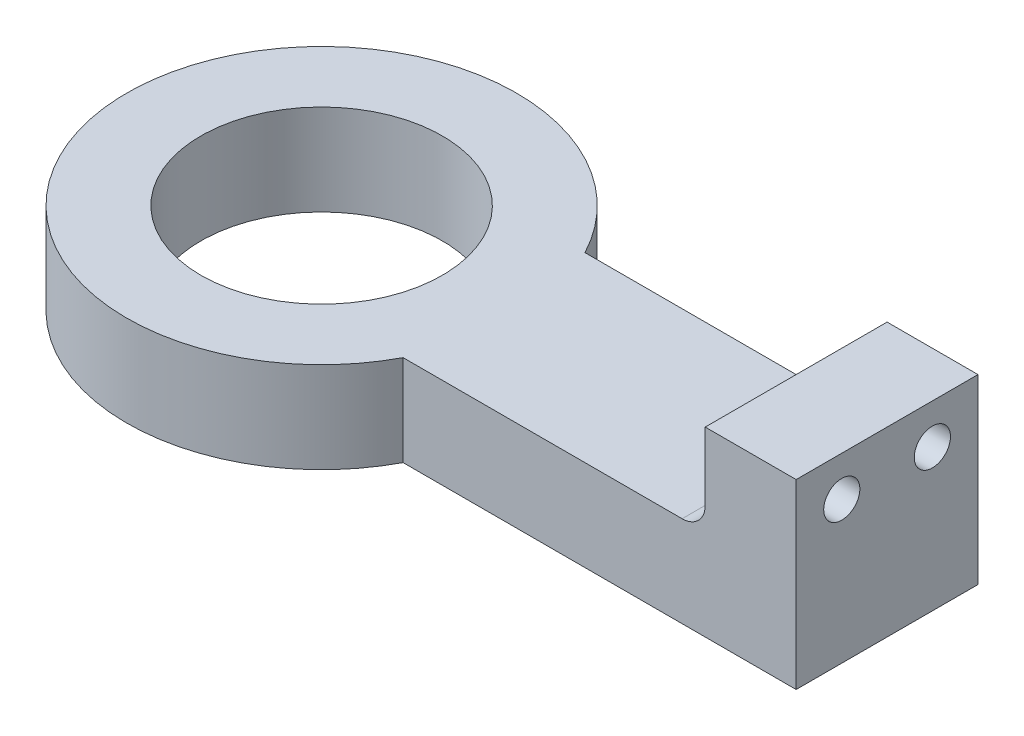
ISO-10303-21;
HEADER;
FILE_DESCRIPTION(('STEP AP214'),'2;1');
FILE_NAME('part.step','',(''),(''),'','','');
FILE_SCHEMA(('AUTOMOTIVE_DESIGN { 1 0 10303 214 1 1 1 1 }'));
ENDSEC;
DATA;
#1=APPLICATION_CONTEXT('core data for automotive mechanical design processes');
#2=APPLICATION_PROTOCOL_DEFINITION('international standard','automotive_design',2000,#1);
#3=PRODUCT_CONTEXT('',#1,'mechanical');
#4=PRODUCT('Part','Part','',(#3));
#5=PRODUCT_RELATED_PRODUCT_CATEGORY('part','',(#4));
#6=PRODUCT_DEFINITION_FORMATION('','',#4);
#7=PRODUCT_DEFINITION_CONTEXT('part definition',#1,'design');
#8=PRODUCT_DEFINITION('design','',#6,#7);
#9=PRODUCT_DEFINITION_SHAPE('','',#8);
#10=(LENGTH_UNIT() NAMED_UNIT(*) SI_UNIT(.MILLI.,.METRE.));
#11=(NAMED_UNIT(*) PLANE_ANGLE_UNIT() SI_UNIT($,.RADIAN.));
#12=(NAMED_UNIT(*) SI_UNIT($,.STERADIAN.) SOLID_ANGLE_UNIT());
#13=UNCERTAINTY_MEASURE_WITH_UNIT(LENGTH_MEASURE(1.E-05),#10,'distance_accuracy_value','');
#14=(GEOMETRIC_REPRESENTATION_CONTEXT(3) GLOBAL_UNCERTAINTY_ASSIGNED_CONTEXT((#13)) GLOBAL_UNIT_ASSIGNED_CONTEXT((#10,
#11,#12)) REPRESENTATION_CONTEXT('',''));
#15=CARTESIAN_POINT('',(0.,0.,0.));
#16=DIRECTION('',(0.,0.,1.));
#17=DIRECTION('',(1.,0.,0.));
#18=AXIS2_PLACEMENT_3D('',#15,#16,#17);
#19=CARTESIAN_POINT('',(0.,20.,0.));
#20=DIRECTION('',(0.,1.,0.));
#21=DIRECTION('',(0.,0.,1.));
#22=AXIS2_PLACEMENT_3D('',#19,#20,#21);
#23=PLANE('',#22);
#24=CARTESIAN_POINT('',(0.,20.,0.));
#25=DIRECTION('',(0.,1.,0.));
#26=DIRECTION('',(0.,0.,1.));
#27=AXIS2_PLACEMENT_3D('',#24,#25,#26);
#28=CIRCLE('',#27,26.56205);
#29=CARTESIAN_POINT('',(0.,20.,26.56205));
#30=VERTEX_POINT('',#29);
#31=EDGE_CURVE('E125',#30,#30,#28,.T.);
#32=ORIENTED_EDGE('',*,*,#31,.F.);
#33=EDGE_LOOP('',(#32));
#34=FACE_BOUND('',#33,.T.);
#35=DIRECTION('',(1.,0.,0.));
#36=VECTOR('',#35,1.);
#37=CARTESIAN_POINT('',(0.,20.,20.));
#38=LINE('',#37,#36);
#39=CARTESIAN_POINT('',(37.9228169957053,20.,20.));
#40=VERTEX_POINT('',#39);
#41=CARTESIAN_POINT('',(99.2928169957053,20.,20.));
#42=VERTEX_POINT('',#41);
#43=EDGE_CURVE('E134',#40,#42,#38,.T.);
#44=ORIENTED_EDGE('',*,*,#43,.T.);
#45=DIRECTION('',(0.,0.,-1.));
#46=VECTOR('',#45,1.);
#47=CARTESIAN_POINT('',(99.2928169957053,20.,-20.));
#48=LINE('',#47,#46);
#49=CARTESIAN_POINT('',(99.2928169957053,20.,-20.));
#50=VERTEX_POINT('',#49);
#51=EDGE_CURVE('E174',#42,#50,#48,.T.);
#52=ORIENTED_EDGE('',*,*,#51,.T.);
#53=DIRECTION('',(1.,0.,0.));
#54=VECTOR('',#53,1.);
#55=CARTESIAN_POINT('',(0.,20.,-20.));
#56=LINE('',#55,#54);
#57=CARTESIAN_POINT('',(37.9228169957053,20.,-20.));
#58=VERTEX_POINT('',#57);
#59=EDGE_CURVE('E138',#58,#50,#56,.T.);
#60=ORIENTED_EDGE('',*,*,#59,.F.);
#61=CARTESIAN_POINT('',(0.,20.,0.));
#62=DIRECTION('',(0.,1.,0.));
#63=DIRECTION('',(0.,0.,1.));
#64=AXIS2_PLACEMENT_3D('',#61,#62,#63);
#65=CIRCLE('',#64,42.8735355305549);
#66=EDGE_CURVE('E129',#58,#40,#65,.T.);
#67=ORIENTED_EDGE('',*,*,#66,.T.);
#68=EDGE_LOOP('',(#44,#52,#60,#67));
#69=FACE_BOUND('',#68,.T.);
#70=ADVANCED_FACE('F41',(#34,#69),#23,.T.);
#71=CARTESIAN_POINT('',(0.,20.,0.));
#72=DIRECTION('',(0.,-1.,0.));
#73=DIRECTION('',(0.,0.,-1.));
#74=AXIS2_PLACEMENT_3D('',#71,#72,#73);
#75=CYLINDRICAL_SURFACE('',#74,42.8735355305549);
#76=CARTESIAN_POINT('',(0.,0.,0.));
#77=DIRECTION('',(0.,1.,0.));
#78=DIRECTION('',(0.,0.,1.));
#79=AXIS2_PLACEMENT_3D('',#76,#77,#78);
#80=CIRCLE('',#79,42.8735355305549);
#81=CARTESIAN_POINT('',(37.9228169957053,0.,-20.));
#82=VERTEX_POINT('',#81);
#83=CARTESIAN_POINT('',(37.9228169957053,0.,20.));
#84=VERTEX_POINT('',#83);
#85=EDGE_CURVE('E146',#82,#84,#80,.T.);
#86=ORIENTED_EDGE('',*,*,#85,.T.);
#87=DIRECTION('',(0.,-1.,0.));
#88=VECTOR('',#87,1.);
#89=CARTESIAN_POINT('',(37.9228169957053,20.,20.));
#90=LINE('',#89,#88);
#91=EDGE_CURVE('E170',#40,#84,#90,.T.);
#92=ORIENTED_EDGE('',*,*,#91,.F.);
#93=ORIENTED_EDGE('',*,*,#66,.F.);
#94=DIRECTION('',(0.,-1.,0.));
#95=VECTOR('',#94,1.);
#96=CARTESIAN_POINT('',(37.9228169957053,20.,-20.));
#97=LINE('',#96,#95);
#98=EDGE_CURVE('E141',#58,#82,#97,.T.);
#99=ORIENTED_EDGE('',*,*,#98,.T.);
#100=EDGE_LOOP('',(#86,#92,#93,#99));
#101=FACE_BOUND('',#100,.T.);
#102=ADVANCED_FACE('F225',(#101),#75,.T.);
#103=CARTESIAN_POINT('',(0.,20.,20.));
#104=DIRECTION('',(0.,0.,-1.));
#105=DIRECTION('',(-1.,0.,0.));
#106=AXIS2_PLACEMENT_3D('',#103,#104,#105);
#107=PLANE('',#106);
#108=DIRECTION('',(1.,0.,0.));
#109=VECTOR('',#108,1.);
#110=CARTESIAN_POINT('',(0.,0.,20.));
#111=LINE('',#110,#109);
#112=CARTESIAN_POINT('',(124.372816995705,0.,20.));
#113=VERTEX_POINT('',#112);
#114=EDGE_CURVE('E151',#84,#113,#111,.T.);
#115=ORIENTED_EDGE('',*,*,#114,.T.);
#116=DIRECTION('',(0.,-1.,0.));
#117=VECTOR('',#116,1.);
#118=CARTESIAN_POINT('',(124.372816995705,20.,20.));
#119=LINE('',#118,#117);
#120=CARTESIAN_POINT('',(124.372816995705,40.,20.));
#121=VERTEX_POINT('',#120);
#122=EDGE_CURVE('E167',#121,#113,#119,.T.);
#123=ORIENTED_EDGE('',*,*,#122,.F.);
#124=DIRECTION('',(-1.,0.,0.));
#125=VECTOR('',#124,1.);
#126=CARTESIAN_POINT('',(124.372816995705,40.,20.));
#127=LINE('',#126,#125);
#128=CARTESIAN_POINT('',(104.372816995705,40.,20.));
#129=VERTEX_POINT('',#128);
#130=EDGE_CURVE('E147',#121,#129,#127,.T.);
#131=ORIENTED_EDGE('',*,*,#130,.T.);
#132=DIRECTION('',(0.,-1.,0.));
#133=VECTOR('',#132,1.);
#134=CARTESIAN_POINT('',(104.372816995705,20.,20.));
#135=LINE('',#134,#133);
#136=CARTESIAN_POINT('',(104.372816995705,25.08,20.));
#137=VERTEX_POINT('',#136);
#138=EDGE_CURVE('E110',#129,#137,#135,.T.);
#139=ORIENTED_EDGE('',*,*,#138,.T.);
#140=CARTESIAN_POINT('',(99.2928169957053,25.08,20.));
#141=DIRECTION('',(0.,0.,-1.));
#142=DIRECTION('',(-1.,0.,0.));
#143=AXIS2_PLACEMENT_3D('',#140,#141,#142);
#144=CIRCLE('',#143,5.07999999999999);
#145=EDGE_CURVE('E11',#137,#42,#144,.T.);
#146=ORIENTED_EDGE('',*,*,#145,.T.);
#147=ORIENTED_EDGE('',*,*,#43,.F.);
#148=ORIENTED_EDGE('',*,*,#91,.T.);
#149=EDGE_LOOP('',(#115,#123,#131,#139,#146,#147,#148));
#150=FACE_BOUND('',#149,.T.);
#151=ADVANCED_FACE('F231',(#150),#107,.F.);
#152=CARTESIAN_POINT('',(124.372816995705,20.,0.));
#153=DIRECTION('',(1.,0.,0.));
#154=DIRECTION('',(0.,0.,-1.));
#155=AXIS2_PLACEMENT_3D('',#152,#153,#154);
#156=PLANE('',#155);
#157=CARTESIAN_POINT('',(124.372816995705,31.22176,9.96191999999998));
#158=DIRECTION('',(-1.,0.,0.));
#159=DIRECTION('',(0.,0.,1.));
#160=AXIS2_PLACEMENT_3D('',#157,#158,#159);
#161=CIRCLE('',#160,3.9773733);
#162=CARTESIAN_POINT('',(124.372816995705,31.22176,13.9392933));
#163=VERTEX_POINT('',#162);
#164=EDGE_CURVE('E105',#163,#163,#161,.T.);
#165=ORIENTED_EDGE('',*,*,#164,.T.);
#166=EDGE_LOOP('',(#165));
#167=FACE_BOUND('',#166,.T.);
#168=CARTESIAN_POINT('',(124.372816995705,31.22176,-9.96192000000002));
#169=DIRECTION('',(-1.,0.,0.));
#170=DIRECTION('',(0.,0.,1.));
#171=AXIS2_PLACEMENT_3D('',#168,#169,#170);
#172=CIRCLE('',#171,3.985133);
#173=CARTESIAN_POINT('',(124.372816995705,31.22176,-5.97678700000002));
#174=VERTEX_POINT('',#173);
#175=EDGE_CURVE('E190',#174,#174,#172,.T.);
#176=ORIENTED_EDGE('',*,*,#175,.T.);
#177=EDGE_LOOP('',(#176));
#178=FACE_BOUND('',#177,.T.);
#179=DIRECTION('',(0.,0.,1.));
#180=VECTOR('',#179,1.);
#181=CARTESIAN_POINT('',(124.372816995705,0.,0.));
#182=LINE('',#181,#180);
#183=CARTESIAN_POINT('',(124.372816995705,0.,-20.));
#184=VERTEX_POINT('',#183);
#185=EDGE_CURVE('E155',#184,#113,#182,.T.);
#186=ORIENTED_EDGE('',*,*,#185,.F.);
#187=DIRECTION('',(0.,-1.,0.));
#188=VECTOR('',#187,1.);
#189=CARTESIAN_POINT('',(124.372816995705,20.,-20.));
#190=LINE('',#189,#188);
#191=CARTESIAN_POINT('',(124.372816995705,40.,-20.));
#192=VERTEX_POINT('',#191);
#193=EDGE_CURVE('E164',#192,#184,#190,.T.);
#194=ORIENTED_EDGE('',*,*,#193,.F.);
#195=DIRECTION('',(0.,0.,-1.));
#196=VECTOR('',#195,1.);
#197=CARTESIAN_POINT('',(124.372816995705,40.,48.2842712474619));
#198=LINE('',#197,#196);
#199=EDGE_CURVE('E114',#121,#192,#198,.T.);
#200=ORIENTED_EDGE('',*,*,#199,.F.);
#201=ORIENTED_EDGE('',*,*,#122,.T.);
#202=EDGE_LOOP('',(#186,#194,#200,#201));
#203=FACE_BOUND('',#202,.T.);
#204=ADVANCED_FACE('F202',(#167,#178,#203),#156,.T.);
#205=CARTESIAN_POINT('',(0.,20.,0.));
#206=DIRECTION('',(0.,-1.,0.));
#207=DIRECTION('',(0.,0.,-1.));
#208=AXIS2_PLACEMENT_3D('',#205,#206,#207);
#209=CYLINDRICAL_SURFACE('',#208,26.56205);
#210=ORIENTED_EDGE('',*,*,#31,.T.);
#211=EDGE_LOOP('',(#210));
#212=FACE_BOUND('',#211,.T.);
#213=CARTESIAN_POINT('',(0.,0.,0.));
#214=DIRECTION('',(0.,1.,0.));
#215=DIRECTION('',(0.,0.,1.));
#216=AXIS2_PLACEMENT_3D('',#213,#214,#215);
#217=CIRCLE('',#216,26.56205);
#218=CARTESIAN_POINT('',(0.,0.,26.56205));
#219=VERTEX_POINT('',#218);
#220=EDGE_CURVE('E142',#219,#219,#217,.T.);
#221=ORIENTED_EDGE('',*,*,#220,.F.);
#222=EDGE_LOOP('',(#221));
#223=FACE_BOUND('',#222,.T.);
#224=ADVANCED_FACE('F243',(#212,#223),#209,.F.);
#225=CARTESIAN_POINT('',(0.,20.,-20.));
#226=DIRECTION('',(0.,0.,-1.));
#227=DIRECTION('',(-1.,0.,0.));
#228=AXIS2_PLACEMENT_3D('',#225,#226,#227);
#229=PLANE('',#228);
#230=DIRECTION('',(1.,0.,0.));
#231=VECTOR('',#230,1.);
#232=CARTESIAN_POINT('',(0.,0.,-20.));
#233=LINE('',#232,#231);
#234=EDGE_CURVE('E130',#82,#184,#233,.T.);
#235=ORIENTED_EDGE('',*,*,#234,.F.);
#236=ORIENTED_EDGE('',*,*,#98,.F.);
#237=ORIENTED_EDGE('',*,*,#59,.T.);
#238=CARTESIAN_POINT('',(99.2928169957053,25.08,-20.));
#239=DIRECTION('',(0.,0.,-1.));
#240=DIRECTION('',(-1.,0.,0.));
#241=AXIS2_PLACEMENT_3D('',#238,#239,#240);
#242=CIRCLE('',#241,5.07999999999999);
#243=CARTESIAN_POINT('',(104.372816995705,25.08,-20.));
#244=VERTEX_POINT('',#243);
#245=EDGE_CURVE('E50',#50,#244,#242,.F.);
#246=ORIENTED_EDGE('',*,*,#245,.T.);
#247=DIRECTION('',(0.,1.,0.));
#248=VECTOR('',#247,1.);
#249=CARTESIAN_POINT('',(104.372816995705,20.,-20.));
#250=LINE('',#249,#248);
#251=CARTESIAN_POINT('',(104.372816995705,40.,-20.));
#252=VERTEX_POINT('',#251);
#253=EDGE_CURVE('E98',#244,#252,#250,.T.);
#254=ORIENTED_EDGE('',*,*,#253,.T.);
#255=DIRECTION('',(1.,0.,0.));
#256=VECTOR('',#255,1.);
#257=CARTESIAN_POINT('',(124.372816995705,40.,-20.));
#258=LINE('',#257,#256);
#259=EDGE_CURVE('E103',#252,#192,#258,.T.);
#260=ORIENTED_EDGE('',*,*,#259,.T.);
#261=ORIENTED_EDGE('',*,*,#193,.T.);
#262=EDGE_LOOP('',(#235,#236,#237,#246,#254,#260,#261));
#263=FACE_BOUND('',#262,.T.);
#264=ADVANCED_FACE('F101',(#263),#229,.T.);
#265=CARTESIAN_POINT('',(0.,0.,0.));
#266=DIRECTION('',(0.,1.,0.));
#267=DIRECTION('',(0.,0.,1.));
#268=AXIS2_PLACEMENT_3D('',#265,#266,#267);
#269=PLANE('',#268);
#270=ORIENTED_EDGE('',*,*,#220,.T.);
#271=EDGE_LOOP('',(#270));
#272=FACE_BOUND('',#271,.T.);
#273=ORIENTED_EDGE('',*,*,#85,.F.);
#274=ORIENTED_EDGE('',*,*,#234,.T.);
#275=ORIENTED_EDGE('',*,*,#185,.T.);
#276=ORIENTED_EDGE('',*,*,#114,.F.);
#277=EDGE_LOOP('',(#273,#274,#275,#276));
#278=FACE_BOUND('',#277,.T.);
#279=ADVANCED_FACE('F237',(#272,#278),#269,.F.);
#280=CARTESIAN_POINT('',(124.372816995705,40.,48.2842712474619));
#281=DIRECTION('',(0.,1.,0.));
#282=DIRECTION('',(0.,0.,1.));
#283=AXIS2_PLACEMENT_3D('',#280,#281,#282);
#284=PLANE('',#283);
#285=ORIENTED_EDGE('',*,*,#130,.F.);
#286=ORIENTED_EDGE('',*,*,#199,.T.);
#287=ORIENTED_EDGE('',*,*,#259,.F.);
#288=DIRECTION('',(0.,0.,-1.));
#289=VECTOR('',#288,1.);
#290=CARTESIAN_POINT('',(104.372816995705,40.,48.2842712474619));
#291=LINE('',#290,#289);
#292=EDGE_CURVE('E108',#129,#252,#291,.T.);
#293=ORIENTED_EDGE('',*,*,#292,.F.);
#294=EDGE_LOOP('',(#285,#286,#287,#293));
#295=FACE_BOUND('',#294,.T.);
#296=ADVANCED_FACE('F117',(#295),#284,.T.);
#297=CARTESIAN_POINT('',(104.372816995705,20.,48.2842712474619));
#298=DIRECTION('',(-1.,0.,0.));
#299=DIRECTION('',(0.,0.,1.));
#300=AXIS2_PLACEMENT_3D('',#297,#298,#299);
#301=PLANE('',#300);
#302=CARTESIAN_POINT('',(104.372816995705,31.22176,9.96191999999998));
#303=DIRECTION('',(-1.,0.,0.));
#304=DIRECTION('',(0.,0.,1.));
#305=AXIS2_PLACEMENT_3D('',#302,#303,#304);
#306=CIRCLE('',#305,3.9773733);
#307=CARTESIAN_POINT('',(104.372816995705,31.22176,13.9392933));
#308=VERTEX_POINT('',#307);
#309=EDGE_CURVE('E194',#308,#308,#306,.T.);
#310=ORIENTED_EDGE('',*,*,#309,.F.);
#311=EDGE_LOOP('',(#310));
#312=FACE_BOUND('',#311,.T.);
#313=CARTESIAN_POINT('',(104.372816995705,31.22176,-9.96192000000002));
#314=DIRECTION('',(-1.,0.,0.));
#315=DIRECTION('',(0.,0.,1.));
#316=AXIS2_PLACEMENT_3D('',#313,#314,#315);
#317=CIRCLE('',#316,3.985133);
#318=CARTESIAN_POINT('',(104.372816995705,31.22176,-5.97678700000002));
#319=VERTEX_POINT('',#318);
#320=EDGE_CURVE('E186',#319,#319,#317,.T.);
#321=ORIENTED_EDGE('',*,*,#320,.F.);
#322=EDGE_LOOP('',(#321));
#323=FACE_BOUND('',#322,.T.);
#324=ORIENTED_EDGE('',*,*,#253,.F.);
#325=DIRECTION('',(0.,0.,-1.));
#326=VECTOR('',#325,1.);
#327=CARTESIAN_POINT('',(104.372816995705,25.08,20.));
#328=LINE('',#327,#326);
#329=EDGE_CURVE('E63',#244,#137,#328,.F.);
#330=ORIENTED_EDGE('',*,*,#329,.T.);
#331=ORIENTED_EDGE('',*,*,#138,.F.);
#332=ORIENTED_EDGE('',*,*,#292,.T.);
#333=EDGE_LOOP('',(#324,#330,#331,#332));
#334=FACE_BOUND('',#333,.T.);
#335=ADVANCED_FACE('F109',(#312,#323,#334),#301,.T.);
#336=CARTESIAN_POINT('',(124.372816995705,31.22176,-9.96192000000002));
#337=DIRECTION('',(-1.,0.,0.));
#338=DIRECTION('',(0.,0.,1.));
#339=AXIS2_PLACEMENT_3D('',#336,#337,#338);
#340=CYLINDRICAL_SURFACE('',#339,3.985133);
#341=ORIENTED_EDGE('',*,*,#175,.F.);
#342=EDGE_LOOP('',(#341));
#343=FACE_BOUND('',#342,.T.);
#344=ORIENTED_EDGE('',*,*,#320,.T.);
#345=EDGE_LOOP('',(#344));
#346=FACE_BOUND('',#345,.T.);
#347=ADVANCED_FACE('F208',(#343,#346),#340,.F.);
#348=CARTESIAN_POINT('',(124.372816995705,31.22176,9.96191999999998));
#349=DIRECTION('',(-1.,0.,0.));
#350=DIRECTION('',(0.,0.,1.));
#351=AXIS2_PLACEMENT_3D('',#348,#349,#350);
#352=CYLINDRICAL_SURFACE('',#351,3.9773733);
#353=ORIENTED_EDGE('',*,*,#164,.F.);
#354=EDGE_LOOP('',(#353));
#355=FACE_BOUND('',#354,.T.);
#356=ORIENTED_EDGE('',*,*,#309,.T.);
#357=EDGE_LOOP('',(#356));
#358=FACE_BOUND('',#357,.T.);
#359=ADVANCED_FACE('F205',(#355,#358),#352,.F.);
#360=CARTESIAN_POINT('',(99.2928169957053,25.08,0.));
#361=DIRECTION('',(0.,0.,1.));
#362=DIRECTION('',(1.,0.,0.));
#363=AXIS2_PLACEMENT_3D('',#360,#361,#362);
#364=CYLINDRICAL_SURFACE('',#363,5.07999999999999);
#365=ORIENTED_EDGE('',*,*,#145,.F.);
#366=ORIENTED_EDGE('',*,*,#329,.F.);
#367=ORIENTED_EDGE('',*,*,#245,.F.);
#368=ORIENTED_EDGE('',*,*,#51,.F.);
#369=EDGE_LOOP('',(#365,#366,#367,#368));
#370=FACE_BOUND('',#369,.T.);
#371=ADVANCED_FACE('F43',(#370),#364,.F.);
#372=CLOSED_SHELL('',(#70,#102,#151,#204,#224,#264,#279,#296,#335,#347,#359,#371));
#373=MANIFOLD_SOLID_BREP('B2',#372);
#374=ADVANCED_BREP_SHAPE_REPRESENTATION('',(#18,#373),#14);
#375=SHAPE_DEFINITION_REPRESENTATION(#9,#374);
ENDSEC;
END-ISO-10303-21;
